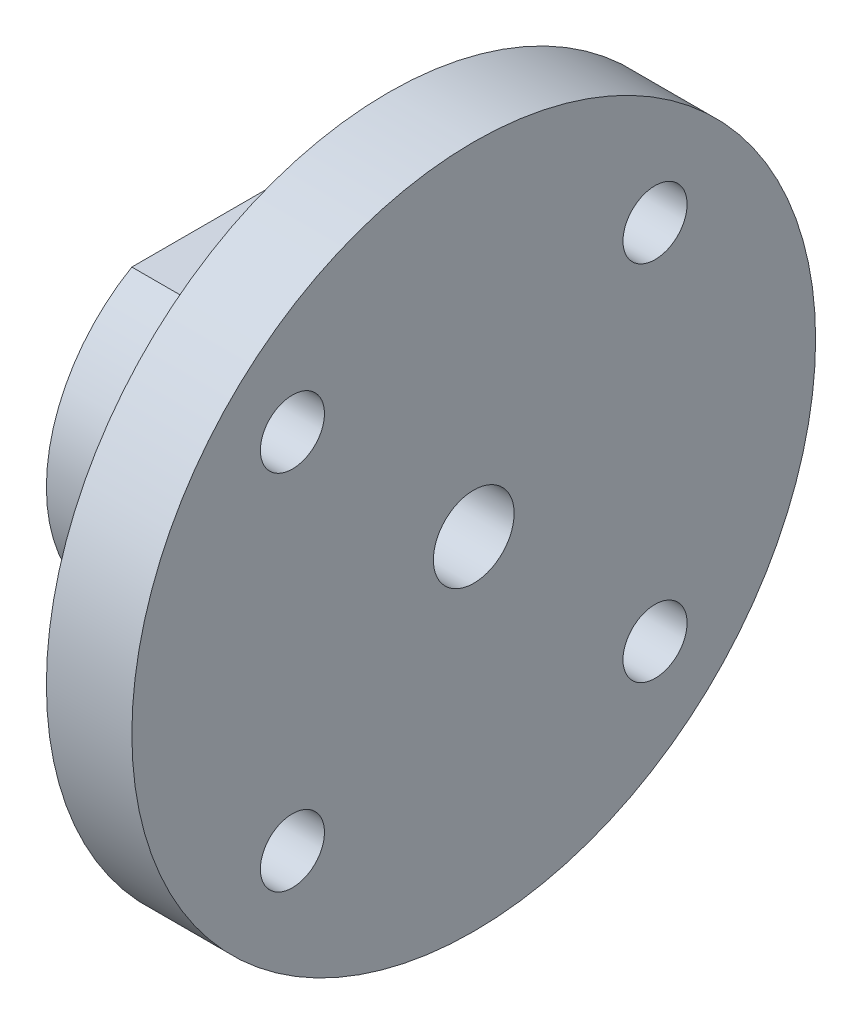
ISO-10303-21;
HEADER;
FILE_DESCRIPTION(('STEP AP214'),'2;1');
FILE_NAME('part.step','',(''),(''),'','','');
FILE_SCHEMA(('AUTOMOTIVE_DESIGN { 1 0 10303 214 1 1 1 1 }'));
ENDSEC;
DATA;
#1=APPLICATION_CONTEXT('core data for automotive mechanical design processes');
#2=APPLICATION_PROTOCOL_DEFINITION('international standard','automotive_design',2000,#1);
#3=PRODUCT_CONTEXT('',#1,'mechanical');
#4=PRODUCT('Part','Part','',(#3));
#5=PRODUCT_RELATED_PRODUCT_CATEGORY('part','',(#4));
#6=PRODUCT_DEFINITION_FORMATION('','',#4);
#7=PRODUCT_DEFINITION_CONTEXT('part definition',#1,'design');
#8=PRODUCT_DEFINITION('design','',#6,#7);
#9=PRODUCT_DEFINITION_SHAPE('','',#8);
#10=(LENGTH_UNIT() NAMED_UNIT(*) SI_UNIT(.MILLI.,.METRE.));
#11=(NAMED_UNIT(*) PLANE_ANGLE_UNIT() SI_UNIT($,.RADIAN.));
#12=(NAMED_UNIT(*) SI_UNIT($,.STERADIAN.) SOLID_ANGLE_UNIT());
#13=UNCERTAINTY_MEASURE_WITH_UNIT(LENGTH_MEASURE(1.E-05),#10,'distance_accuracy_value','');
#14=(GEOMETRIC_REPRESENTATION_CONTEXT(3) GLOBAL_UNCERTAINTY_ASSIGNED_CONTEXT((#13)) GLOBAL_UNIT_ASSIGNED_CONTEXT((#10,
#11,#12)) REPRESENTATION_CONTEXT('',''));
#15=CARTESIAN_POINT('',(0.,0.,0.));
#16=DIRECTION('',(0.,0.,1.));
#17=DIRECTION('',(1.,0.,0.));
#18=AXIS2_PLACEMENT_3D('',#15,#16,#17);
#19=CARTESIAN_POINT('',(-6.35,-28.081421358,0.));
#20=DIRECTION('',(-1.,0.,0.));
#21=DIRECTION('',(0.,0.,1.));
#22=AXIS2_PLACEMENT_3D('',#19,#20,#21);
#23=PLANE('',#22);
#24=CARTESIAN_POINT('',(-6.35,0.,0.));
#25=DIRECTION('',(1.,0.,0.));
#26=DIRECTION('',(0.,0.,-1.));
#27=AXIS2_PLACEMENT_3D('',#24,#25,#26);
#28=CIRCLE('',#27,1.4999999972);
#29=CARTESIAN_POINT('',(-6.35,0.,-1.4999999972));
#30=VERTEX_POINT('',#29);
#31=EDGE_CURVE('E19',#30,#30,#28,.F.);
#32=ORIENTED_EDGE('',*,*,#31,.F.);
#33=EDGE_LOOP('',(#32));
#34=FACE_BOUND('',#33,.T.);
#35=DIRECTION('',(0.,0.,1.));
#36=VECTOR('',#35,1.);
#37=CARTESIAN_POINT('',(-6.35,-5.4992613154,0.));
#38=LINE('',#37,#36);
#39=CARTESIAN_POINT('',(-6.35,-5.4992613154,3.17499999881457));
#40=VERTEX_POINT('',#39);
#41=CARTESIAN_POINT('',(-6.35,-5.4992613148867,-3.17499999851821));
#42=VERTEX_POINT('',#41);
#43=EDGE_CURVE('E64',#40,#42,#38,.F.);
#44=ORIENTED_EDGE('',*,*,#43,.F.);
#45=CARTESIAN_POINT('',(-6.35,0.,0.));
#46=DIRECTION('',(1.,0.,0.));
#47=DIRECTION('',(0.,0.,-1.));
#48=AXIS2_PLACEMENT_3D('',#45,#46,#47);
#49=CIRCLE('',#48,6.35);
#50=CARTESIAN_POINT('',(-6.35,5.4992613148867,3.17499999851821));
#51=VERTEX_POINT('',#50);
#52=EDGE_CURVE('E55',#51,#40,#49,.T.);
#53=ORIENTED_EDGE('',*,*,#52,.F.);
#54=DIRECTION('',(0.,0.,1.));
#55=VECTOR('',#54,1.);
#56=CARTESIAN_POINT('',(-6.35,5.4992613154,0.));
#57=LINE('',#56,#55);
#58=CARTESIAN_POINT('',(-6.35,5.4992613154,-3.17499999881457));
#59=VERTEX_POINT('',#58);
#60=EDGE_CURVE('E77',#59,#51,#57,.T.);
#61=ORIENTED_EDGE('',*,*,#60,.F.);
#62=CARTESIAN_POINT('',(-6.35,0.,0.));
#63=DIRECTION('',(1.,0.,0.));
#64=DIRECTION('',(0.,0.,-1.));
#65=AXIS2_PLACEMENT_3D('',#62,#63,#64);
#66=CIRCLE('',#65,6.35);
#67=EDGE_CURVE('E66',#42,#59,#66,.T.);
#68=ORIENTED_EDGE('',*,*,#67,.F.);
#69=EDGE_LOOP('',(#44,#53,#61,#68));
#70=FACE_BOUND('',#69,.T.);
#71=ADVANCED_FACE('F16',(#34,#70),#23,.T.);
#72=CARTESIAN_POINT('',(-6.35,0.,0.));
#73=DIRECTION('',(1.,0.,0.));
#74=DIRECTION('',(0.,0.,-1.));
#75=AXIS2_PLACEMENT_3D('',#72,#73,#74);
#76=CYLINDRICAL_SURFACE('',#75,1.4999999972);
#77=CARTESIAN_POINT('',(3.175,0.,0.));
#78=DIRECTION('',(1.,0.,0.));
#79=DIRECTION('',(0.,0.,-1.));
#80=AXIS2_PLACEMENT_3D('',#77,#78,#79);
#81=CIRCLE('',#80,1.4999999972);
#82=CARTESIAN_POINT('',(3.175,0.,-1.4999999972));
#83=VERTEX_POINT('',#82);
#84=EDGE_CURVE('E101',#83,#83,#81,.F.);
#85=ORIENTED_EDGE('',*,*,#84,.F.);
#86=EDGE_LOOP('',(#85));
#87=FACE_BOUND('',#86,.T.);
#88=ORIENTED_EDGE('',*,*,#31,.T.);
#89=EDGE_LOOP('',(#88));
#90=FACE_BOUND('',#89,.T.);
#91=ADVANCED_FACE('F230',(#87,#90),#76,.F.);
#92=CARTESIAN_POINT('',(0.,0.,0.));
#93=DIRECTION('',(-1.,0.,0.));
#94=DIRECTION('',(0.,0.,1.));
#95=AXIS2_PLACEMENT_3D('',#92,#93,#94);
#96=CYLINDRICAL_SURFACE('',#95,12.7);
#97=CARTESIAN_POINT('',(0.,0.,0.));
#98=DIRECTION('',(-1.,0.,0.));
#99=DIRECTION('',(0.,0.,1.));
#100=AXIS2_PLACEMENT_3D('',#97,#98,#99);
#101=CIRCLE('',#100,12.7);
#102=CARTESIAN_POINT('',(0.,0.,12.7));
#103=VERTEX_POINT('',#102);
#104=EDGE_CURVE('E98',#103,#103,#101,.T.);
#105=ORIENTED_EDGE('',*,*,#104,.F.);
#106=EDGE_LOOP('',(#105));
#107=FACE_BOUND('',#106,.T.);
#108=CARTESIAN_POINT('',(3.175,0.,0.));
#109=DIRECTION('',(-1.,0.,0.));
#110=DIRECTION('',(0.,0.,1.));
#111=AXIS2_PLACEMENT_3D('',#108,#109,#110);
#112=CIRCLE('',#111,12.7);
#113=CARTESIAN_POINT('',(3.175,0.,12.7));
#114=VERTEX_POINT('',#113);
#115=EDGE_CURVE('E113',#114,#114,#112,.F.);
#116=ORIENTED_EDGE('',*,*,#115,.F.);
#117=EDGE_LOOP('',(#116));
#118=FACE_BOUND('',#117,.T.);
#119=ADVANCED_FACE('F221',(#107,#118),#96,.T.);
#120=CARTESIAN_POINT('',(3.175,-6.7351920922,6.7351920922));
#121=DIRECTION('',(-1.,0.,0.));
#122=DIRECTION('',(0.,0.,1.));
#123=AXIS2_PLACEMENT_3D('',#120,#121,#122);
#124=CYLINDRICAL_SURFACE('',#123,1.190625);
#125=CARTESIAN_POINT('',(-1.39821834665987E-09,-6.7351920922,6.7351920922));
#126=DIRECTION('',(-1.,0.,0.));
#127=DIRECTION('',(0.,0.,1.));
#128=AXIS2_PLACEMENT_3D('',#125,#126,#127);
#129=CIRCLE('',#128,1.190625);
#130=CARTESIAN_POINT('',(-1.39821834665987E-09,-6.7351920922,7.9258170922));
#131=VERTEX_POINT('',#130);
#132=EDGE_CURVE('E95',#131,#131,#129,.F.);
#133=ORIENTED_EDGE('',*,*,#132,.F.);
#134=EDGE_LOOP('',(#133));
#135=FACE_BOUND('',#134,.T.);
#136=CARTESIAN_POINT('',(3.17499999860178,-6.7351920922,6.7351920922));
#137=DIRECTION('',(-1.,0.,0.));
#138=DIRECTION('',(0.,0.,1.));
#139=AXIS2_PLACEMENT_3D('',#136,#137,#138);
#140=CIRCLE('',#139,1.190625);
#141=CARTESIAN_POINT('',(3.17499999860178,-6.7351920922,7.9258170922));
#142=VERTEX_POINT('',#141);
#143=EDGE_CURVE('E110',#142,#142,#140,.T.);
#144=ORIENTED_EDGE('',*,*,#143,.F.);
#145=EDGE_LOOP('',(#144));
#146=FACE_BOUND('',#145,.T.);
#147=ADVANCED_FACE('F212',(#135,#146),#124,.F.);
#148=CARTESIAN_POINT('',(3.175,6.7351920922,6.7351920922));
#149=DIRECTION('',(-1.,0.,0.));
#150=DIRECTION('',(0.,0.,1.));
#151=AXIS2_PLACEMENT_3D('',#148,#149,#150);
#152=CYLINDRICAL_SURFACE('',#151,1.190625);
#153=CARTESIAN_POINT('',(-1.39806612467486E-09,6.7351920922,6.7351920922));
#154=DIRECTION('',(-1.,0.,0.));
#155=DIRECTION('',(0.,0.,1.));
#156=AXIS2_PLACEMENT_3D('',#153,#154,#155);
#157=CIRCLE('',#156,1.190625);
#158=CARTESIAN_POINT('',(-1.39806612467486E-09,6.7351920922,7.9258170922));
#159=VERTEX_POINT('',#158);
#160=EDGE_CURVE('E92',#159,#159,#157,.F.);
#161=ORIENTED_EDGE('',*,*,#160,.F.);
#162=EDGE_LOOP('',(#161));
#163=FACE_BOUND('',#162,.T.);
#164=CARTESIAN_POINT('',(3.17499999860191,6.7351920922,6.7351920922));
#165=DIRECTION('',(-1.,0.,0.));
#166=DIRECTION('',(0.,0.,1.));
#167=AXIS2_PLACEMENT_3D('',#164,#165,#166);
#168=CIRCLE('',#167,1.190625);
#169=CARTESIAN_POINT('',(3.17499999860191,6.7351920922,7.9258170922));
#170=VERTEX_POINT('',#169);
#171=EDGE_CURVE('E107',#170,#170,#168,.T.);
#172=ORIENTED_EDGE('',*,*,#171,.F.);
#173=EDGE_LOOP('',(#172));
#174=FACE_BOUND('',#173,.T.);
#175=ADVANCED_FACE('F136',(#163,#174),#152,.F.);
#176=CARTESIAN_POINT('',(3.175,6.7351920922,-6.7351920922));
#177=DIRECTION('',(-1.,0.,0.));
#178=DIRECTION('',(0.,0.,1.));
#179=AXIS2_PLACEMENT_3D('',#176,#177,#178);
#180=CYLINDRICAL_SURFACE('',#179,1.190625);
#181=CARTESIAN_POINT('',(1.3981676059982E-09,6.7351920922,-6.7351920922));
#182=DIRECTION('',(-1.,0.,0.));
#183=DIRECTION('',(0.,0.,1.));
#184=AXIS2_PLACEMENT_3D('',#181,#182,#183);
#185=CIRCLE('',#184,1.190625);
#186=CARTESIAN_POINT('',(1.3981676059982E-09,6.7351920922,-5.5445670922));
#187=VERTEX_POINT('',#186);
#188=EDGE_CURVE('E89',#187,#187,#185,.F.);
#189=ORIENTED_EDGE('',*,*,#188,.F.);
#190=EDGE_LOOP('',(#189));
#191=FACE_BOUND('',#190,.T.);
#192=CARTESIAN_POINT('',(3.17500000139817,6.7351920922,-6.7351920922));
#193=DIRECTION('',(-1.,0.,0.));
#194=DIRECTION('',(0.,0.,1.));
#195=AXIS2_PLACEMENT_3D('',#192,#193,#194);
#196=CIRCLE('',#195,1.190625);
#197=CARTESIAN_POINT('',(3.17500000139817,6.7351920922,-5.5445670922));
#198=VERTEX_POINT('',#197);
#199=EDGE_CURVE('E104',#198,#198,#196,.T.);
#200=ORIENTED_EDGE('',*,*,#199,.F.);
#201=EDGE_LOOP('',(#200));
#202=FACE_BOUND('',#201,.T.);
#203=ADVANCED_FACE('F128',(#191,#202),#180,.F.);
#204=CARTESIAN_POINT('',(-6.35,5.4992613154,0.));
#205=DIRECTION('',(0.,1.,0.));
#206=DIRECTION('',(0.,0.,1.));
#207=AXIS2_PLACEMENT_3D('',#204,#205,#206);
#208=PLANE('',#207);
#209=ORIENTED_EDGE('',*,*,#60,.T.);
#210=DIRECTION('',(-1.,0.,0.));
#211=VECTOR('',#210,1.);
#212=CARTESIAN_POINT('',(-3.175,5.49926131437339,3.17499999940729));
#213=LINE('',#212,#211);
#214=CARTESIAN_POINT('',(0.,5.4992613148867,3.17499999851821));
#215=VERTEX_POINT('',#214);
#216=EDGE_CURVE('E61',#215,#51,#213,.T.);
#217=ORIENTED_EDGE('',*,*,#216,.F.);
#218=DIRECTION('',(0.,0.,-1.));
#219=VECTOR('',#218,1.);
#220=CARTESIAN_POINT('',(0.,5.4992613154,0.));
#221=LINE('',#220,#219);
#222=CARTESIAN_POINT('',(0.,5.4992613154,-3.17499999881457));
#223=VERTEX_POINT('',#222);
#224=EDGE_CURVE('E88',#223,#215,#221,.F.);
#225=ORIENTED_EDGE('',*,*,#224,.F.);
#226=DIRECTION('',(1.,0.,0.));
#227=VECTOR('',#226,1.);
#228=CARTESIAN_POINT('',(-6.35,5.4992613154,-3.175));
#229=LINE('',#228,#227);
#230=EDGE_CURVE('E78',#223,#59,#229,.F.);
#231=ORIENTED_EDGE('',*,*,#230,.T.);
#232=EDGE_LOOP('',(#209,#217,#225,#231));
#233=FACE_BOUND('',#232,.T.);
#234=ADVANCED_FACE('F126',(#233),#208,.T.);
#235=CARTESIAN_POINT('',(0.,0.,0.));
#236=DIRECTION('',(1.,0.,0.));
#237=DIRECTION('',(0.,0.,-1.));
#238=AXIS2_PLACEMENT_3D('',#235,#236,#237);
#239=CYLINDRICAL_SURFACE('',#238,6.35);
#240=ORIENTED_EDGE('',*,*,#52,.T.);
#241=DIRECTION('',(1.,0.,0.));
#242=VECTOR('',#241,1.);
#243=CARTESIAN_POINT('',(-6.35,-5.4992613154,3.175));
#244=LINE('',#243,#242);
#245=CARTESIAN_POINT('',(0.,-5.4992613154,3.17499999881457));
#246=VERTEX_POINT('',#245);
#247=EDGE_CURVE('E60',#246,#40,#244,.F.);
#248=ORIENTED_EDGE('',*,*,#247,.F.);
#249=CARTESIAN_POINT('',(0.,0.,0.));
#250=DIRECTION('',(1.,0.,0.));
#251=DIRECTION('',(0.,0.,-1.));
#252=AXIS2_PLACEMENT_3D('',#249,#250,#251);
#253=CIRCLE('',#252,6.35);
#254=EDGE_CURVE('E86',#215,#246,#253,.T.);
#255=ORIENTED_EDGE('',*,*,#254,.F.);
#256=ORIENTED_EDGE('',*,*,#216,.T.);
#257=EDGE_LOOP('',(#240,#248,#255,#256));
#258=FACE_BOUND('',#257,.T.);
#259=ADVANCED_FACE('F57',(#258),#239,.T.);
#260=CARTESIAN_POINT('',(-6.35,-5.4992613154,0.));
#261=DIRECTION('',(0.,1.,0.));
#262=DIRECTION('',(0.,0.,1.));
#263=AXIS2_PLACEMENT_3D('',#260,#261,#262);
#264=PLANE('',#263);
#265=ORIENTED_EDGE('',*,*,#43,.T.);
#266=DIRECTION('',(-1.,0.,0.));
#267=VECTOR('',#266,1.);
#268=CARTESIAN_POINT('',(-3.175,-5.49926131437339,-3.17499999940728));
#269=LINE('',#268,#267);
#270=CARTESIAN_POINT('',(0.,-5.4992613148867,-3.17499999851821));
#271=VERTEX_POINT('',#270);
#272=EDGE_CURVE('E34',#271,#42,#269,.T.);
#273=ORIENTED_EDGE('',*,*,#272,.F.);
#274=DIRECTION('',(0.,0.,-1.));
#275=VECTOR('',#274,1.);
#276=CARTESIAN_POINT('',(0.,-5.4992613154,0.));
#277=LINE('',#276,#275);
#278=EDGE_CURVE('E70',#246,#271,#277,.T.);
#279=ORIENTED_EDGE('',*,*,#278,.F.);
#280=ORIENTED_EDGE('',*,*,#247,.T.);
#281=EDGE_LOOP('',(#265,#273,#279,#280));
#282=FACE_BOUND('',#281,.T.);
#283=ADVANCED_FACE('F68',(#282),#264,.F.);
#284=CARTESIAN_POINT('',(0.,0.,0.));
#285=DIRECTION('',(1.,0.,0.));
#286=DIRECTION('',(0.,0.,-1.));
#287=AXIS2_PLACEMENT_3D('',#284,#285,#286);
#288=CYLINDRICAL_SURFACE('',#287,6.35);
#289=CARTESIAN_POINT('',(0.,0.,0.));
#290=DIRECTION('',(1.,0.,0.));
#291=DIRECTION('',(0.,0.,-1.));
#292=AXIS2_PLACEMENT_3D('',#289,#290,#291);
#293=CIRCLE('',#292,6.35);
#294=EDGE_CURVE('E84',#271,#223,#293,.T.);
#295=ORIENTED_EDGE('',*,*,#294,.F.);
#296=ORIENTED_EDGE('',*,*,#272,.T.);
#297=ORIENTED_EDGE('',*,*,#67,.T.);
#298=ORIENTED_EDGE('',*,*,#230,.F.);
#299=EDGE_LOOP('',(#295,#296,#297,#298));
#300=FACE_BOUND('',#299,.T.);
#301=ADVANCED_FACE('F118',(#300),#288,.T.);
#302=CARTESIAN_POINT('',(3.175,0.,0.));
#303=DIRECTION('',(1.,0.,0.));
#304=DIRECTION('',(0.,0.,-1.));
#305=AXIS2_PLACEMENT_3D('',#302,#303,#304);
#306=PLANE('',#305);
#307=ORIENTED_EDGE('',*,*,#84,.T.);
#308=EDGE_LOOP('',(#307));
#309=FACE_BOUND('',#308,.T.);
#310=ORIENTED_EDGE('',*,*,#199,.T.);
#311=EDGE_LOOP('',(#310));
#312=FACE_BOUND('',#311,.T.);
#313=ORIENTED_EDGE('',*,*,#171,.T.);
#314=EDGE_LOOP('',(#313));
#315=FACE_BOUND('',#314,.T.);
#316=ORIENTED_EDGE('',*,*,#143,.T.);
#317=EDGE_LOOP('',(#316));
#318=FACE_BOUND('',#317,.T.);
#319=CARTESIAN_POINT('',(3.17500000139804,-6.7351920922,-6.7351920922));
#320=DIRECTION('',(-1.,0.,0.));
#321=DIRECTION('',(0.,0.,1.));
#322=AXIS2_PLACEMENT_3D('',#319,#320,#321);
#323=CIRCLE('',#322,1.190625);
#324=CARTESIAN_POINT('',(3.17500000139804,-6.7351920922,-5.5445670922));
#325=VERTEX_POINT('',#324);
#326=EDGE_CURVE('E25',#325,#325,#323,.F.);
#327=ORIENTED_EDGE('',*,*,#326,.F.);
#328=EDGE_LOOP('',(#327));
#329=FACE_BOUND('',#328,.T.);
#330=ORIENTED_EDGE('',*,*,#115,.T.);
#331=EDGE_LOOP('',(#330));
#332=FACE_BOUND('',#331,.T.);
#333=ADVANCED_FACE('F146',(#309,#312,#315,#318,#329,#332),#306,.T.);
#334=CARTESIAN_POINT('',(0.,0.,0.));
#335=DIRECTION('',(1.,0.,0.));
#336=DIRECTION('',(0.,0.,-1.));
#337=AXIS2_PLACEMENT_3D('',#334,#335,#336);
#338=PLANE('',#337);
#339=ORIENTED_EDGE('',*,*,#278,.T.);
#340=ORIENTED_EDGE('',*,*,#294,.T.);
#341=ORIENTED_EDGE('',*,*,#224,.T.);
#342=ORIENTED_EDGE('',*,*,#254,.T.);
#343=EDGE_LOOP('',(#339,#340,#341,#342));
#344=FACE_BOUND('',#343,.T.);
#345=ORIENTED_EDGE('',*,*,#188,.T.);
#346=EDGE_LOOP('',(#345));
#347=FACE_BOUND('',#346,.T.);
#348=ORIENTED_EDGE('',*,*,#160,.T.);
#349=EDGE_LOOP('',(#348));
#350=FACE_BOUND('',#349,.T.);
#351=ORIENTED_EDGE('',*,*,#132,.T.);
#352=EDGE_LOOP('',(#351));
#353=FACE_BOUND('',#352,.T.);
#354=CARTESIAN_POINT('',(1.39804053750359E-09,-6.7351920922,-6.7351920922));
#355=DIRECTION('',(-1.,0.,0.));
#356=DIRECTION('',(0.,0.,1.));
#357=AXIS2_PLACEMENT_3D('',#354,#355,#356);
#358=CIRCLE('',#357,1.190625);
#359=CARTESIAN_POINT('',(1.39804053750359E-09,-6.7351920922,-5.5445670922));
#360=VERTEX_POINT('',#359);
#361=EDGE_CURVE('E11',#360,#360,#358,.T.);
#362=ORIENTED_EDGE('',*,*,#361,.F.);
#363=EDGE_LOOP('',(#362));
#364=FACE_BOUND('',#363,.T.);
#365=ORIENTED_EDGE('',*,*,#104,.T.);
#366=EDGE_LOOP('',(#365));
#367=FACE_BOUND('',#366,.T.);
#368=ADVANCED_FACE('F122',(#344,#347,#350,#353,#364,#367),#338,.F.);
#369=CARTESIAN_POINT('',(3.175,-6.7351920922,-6.7351920922));
#370=DIRECTION('',(-1.,0.,0.));
#371=DIRECTION('',(0.,0.,1.));
#372=AXIS2_PLACEMENT_3D('',#369,#370,#371);
#373=CYLINDRICAL_SURFACE('',#372,1.190625);
#374=ORIENTED_EDGE('',*,*,#361,.T.);
#375=EDGE_LOOP('',(#374));
#376=FACE_BOUND('',#375,.T.);
#377=ORIENTED_EDGE('',*,*,#326,.T.);
#378=EDGE_LOOP('',(#377));
#379=FACE_BOUND('',#378,.T.);
#380=ADVANCED_FACE('F139',(#376,#379),#373,.F.);
#381=CLOSED_SHELL('',(#71,#91,#119,#147,#175,#203,#234,#259,#283,#301,#333,#368,#380));
#382=MANIFOLD_SOLID_BREP('B1',#381);
#383=ADVANCED_BREP_SHAPE_REPRESENTATION('',(#18,#382),#14);
#384=SHAPE_DEFINITION_REPRESENTATION(#9,#383);
ENDSEC;
END-ISO-10303-21;
